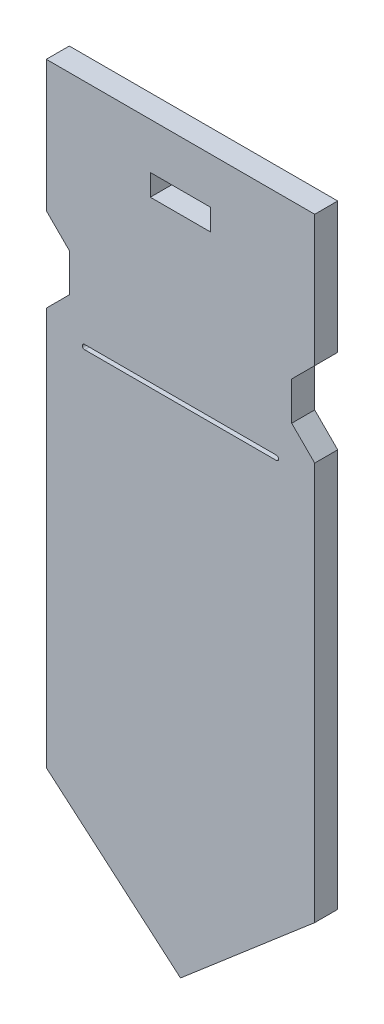
ISO-10303-21;
HEADER;
FILE_DESCRIPTION(('STEP AP214'),'2;1');
FILE_NAME('part.step','',(''),(''),'','','');
FILE_SCHEMA(('AUTOMOTIVE_DESIGN { 1 0 10303 214 1 1 1 1 }'));
ENDSEC;
DATA;
#1=APPLICATION_CONTEXT('core data for automotive mechanical design processes');
#2=APPLICATION_PROTOCOL_DEFINITION('international standard','automotive_design',2000,#1);
#3=PRODUCT_CONTEXT('',#1,'mechanical');
#4=PRODUCT('Part','Part','',(#3));
#5=PRODUCT_RELATED_PRODUCT_CATEGORY('part','',(#4));
#6=PRODUCT_DEFINITION_FORMATION('','',#4);
#7=PRODUCT_DEFINITION_CONTEXT('part definition',#1,'design');
#8=PRODUCT_DEFINITION('design','',#6,#7);
#9=PRODUCT_DEFINITION_SHAPE('','',#8);
#10=(LENGTH_UNIT() NAMED_UNIT(*) SI_UNIT(.MILLI.,.METRE.));
#11=(NAMED_UNIT(*) PLANE_ANGLE_UNIT() SI_UNIT($,.RADIAN.));
#12=(NAMED_UNIT(*) SI_UNIT($,.STERADIAN.) SOLID_ANGLE_UNIT());
#13=UNCERTAINTY_MEASURE_WITH_UNIT(LENGTH_MEASURE(1.E-05),#10,'distance_accuracy_value','');
#14=(GEOMETRIC_REPRESENTATION_CONTEXT(3) GLOBAL_UNCERTAINTY_ASSIGNED_CONTEXT((#13)) GLOBAL_UNIT_ASSIGNED_CONTEXT((#10,
#11,#12)) REPRESENTATION_CONTEXT('',''));
#15=CARTESIAN_POINT('',(0.,0.,0.));
#16=DIRECTION('',(0.,0.,1.));
#17=DIRECTION('',(1.,0.,0.));
#18=AXIS2_PLACEMENT_3D('',#15,#16,#17);
#19=CARTESIAN_POINT('',(32.,0.,3.));
#20=DIRECTION('',(-1.,0.,0.));
#21=DIRECTION('',(0.,0.,1.));
#22=AXIS2_PLACEMENT_3D('',#19,#20,#21);
#23=PLANE('',#22);
#24=DIRECTION('',(0.,1.,0.));
#25=VECTOR('',#24,1.);
#26=CARTESIAN_POINT('',(32.,0.,0.));
#27=LINE('',#26,#25);
#28=CARTESIAN_POINT('',(32.,-25.1,0.));
#29=VERTEX_POINT('',#28);
#30=CARTESIAN_POINT('',(32.,-20.1,0.));
#31=VERTEX_POINT('',#30);
#32=EDGE_CURVE('E323',#29,#31,#27,.T.);
#33=ORIENTED_EDGE('',*,*,#32,.T.);
#34=DIRECTION('',(0.,0.,-1.));
#35=VECTOR('',#34,1.);
#36=CARTESIAN_POINT('',(32.,-20.1,3.));
#37=LINE('',#36,#35);
#38=CARTESIAN_POINT('',(32.,-20.1,3.));
#39=VERTEX_POINT('',#38);
#40=EDGE_CURVE('E11',#39,#31,#37,.T.);
#41=ORIENTED_EDGE('',*,*,#40,.F.);
#42=DIRECTION('',(0.,1.,0.));
#43=VECTOR('',#42,1.);
#44=CARTESIAN_POINT('',(32.,0.,3.));
#45=LINE('',#44,#43);
#46=CARTESIAN_POINT('',(32.,-25.1,3.));
#47=VERTEX_POINT('',#46);
#48=EDGE_CURVE('E225',#47,#39,#45,.T.);
#49=ORIENTED_EDGE('',*,*,#48,.F.);
#50=DIRECTION('',(0.,0.,-1.));
#51=VECTOR('',#50,1.);
#52=CARTESIAN_POINT('',(32.,-25.1,3.));
#53=LINE('',#52,#51);
#54=EDGE_CURVE('E256',#47,#29,#53,.T.);
#55=ORIENTED_EDGE('',*,*,#54,.T.);
#56=EDGE_LOOP('',(#33,#41,#49,#55));
#57=FACE_BOUND('',#56,.T.);
#58=ADVANCED_FACE('F41',(#57),#23,.F.);
#59=CARTESIAN_POINT('',(26.05,-26.05,3.));
#60=DIRECTION('',(-0.707106781186548,0.707106781186547,0.));
#61=DIRECTION('',(-0.707106781186547,-0.707106781186548,0.));
#62=AXIS2_PLACEMENT_3D('',#59,#60,#61);
#63=PLANE('',#62);
#64=DIRECTION('',(0.707106781186547,0.707106781186548,0.));
#65=VECTOR('',#64,1.);
#66=CARTESIAN_POINT('',(26.05,-26.05,0.));
#67=LINE('',#66,#65);
#68=CARTESIAN_POINT('',(35.,-17.1,0.));
#69=VERTEX_POINT('',#68);
#70=EDGE_CURVE('E326',#31,#69,#67,.T.);
#71=ORIENTED_EDGE('',*,*,#70,.T.);
#72=DIRECTION('',(0.,0.,-1.));
#73=VECTOR('',#72,1.);
#74=CARTESIAN_POINT('',(35.,-17.1,3.));
#75=LINE('',#74,#73);
#76=CARTESIAN_POINT('',(35.,-17.1,3.));
#77=VERTEX_POINT('',#76);
#78=EDGE_CURVE('E51',#77,#69,#75,.T.);
#79=ORIENTED_EDGE('',*,*,#78,.F.);
#80=DIRECTION('',(0.707106781186547,0.707106781186548,0.));
#81=VECTOR('',#80,1.);
#82=CARTESIAN_POINT('',(26.05,-26.05,3.));
#83=LINE('',#82,#81);
#84=EDGE_CURVE('E220',#39,#77,#83,.T.);
#85=ORIENTED_EDGE('',*,*,#84,.F.);
#86=ORIENTED_EDGE('',*,*,#40,.T.);
#87=EDGE_LOOP('',(#71,#79,#85,#86));
#88=FACE_BOUND('',#87,.T.);
#89=ADVANCED_FACE('F385',(#88),#63,.F.);
#90=CARTESIAN_POINT('',(35.,0.,3.));
#91=DIRECTION('',(1.,0.,0.));
#92=DIRECTION('',(0.,1.,0.));
#93=AXIS2_PLACEMENT_3D('',#90,#91,#92);
#94=PLANE('',#93);
#95=DIRECTION('',(0.,-1.,0.));
#96=VECTOR('',#95,1.);
#97=CARTESIAN_POINT('',(35.,0.,0.));
#98=LINE('',#97,#96);
#99=CARTESIAN_POINT('',(35.,0.,0.));
#100=VERTEX_POINT('',#99);
#101=EDGE_CURVE('E252',#100,#69,#98,.T.);
#102=ORIENTED_EDGE('',*,*,#101,.F.);
#103=DIRECTION('',(0.,0.,-1.));
#104=VECTOR('',#103,1.);
#105=CARTESIAN_POINT('',(35.,0.,3.));
#106=LINE('',#105,#104);
#107=CARTESIAN_POINT('',(35.,0.,3.));
#108=VERTEX_POINT('',#107);
#109=EDGE_CURVE('E273',#108,#100,#106,.T.);
#110=ORIENTED_EDGE('',*,*,#109,.F.);
#111=DIRECTION('',(0.,-1.,0.));
#112=VECTOR('',#111,1.);
#113=CARTESIAN_POINT('',(35.,0.,3.));
#114=LINE('',#113,#112);
#115=EDGE_CURVE('E213',#108,#77,#114,.T.);
#116=ORIENTED_EDGE('',*,*,#115,.T.);
#117=ORIENTED_EDGE('',*,*,#78,.T.);
#118=EDGE_LOOP('',(#102,#110,#116,#117));
#119=FACE_BOUND('',#118,.T.);
#120=ADVANCED_FACE('F383',(#119),#94,.T.);
#121=CARTESIAN_POINT('',(0.,0.,3.));
#122=DIRECTION('',(0.,1.,0.));
#123=DIRECTION('',(0.,0.,1.));
#124=AXIS2_PLACEMENT_3D('',#121,#122,#123);
#125=PLANE('',#124);
#126=DIRECTION('',(1.,0.,0.));
#127=VECTOR('',#126,1.);
#128=CARTESIAN_POINT('',(0.,0.,0.));
#129=LINE('',#128,#127);
#130=CARTESIAN_POINT('',(0.,0.,0.));
#131=VERTEX_POINT('',#130);
#132=EDGE_CURVE('E330',#131,#100,#129,.T.);
#133=ORIENTED_EDGE('',*,*,#132,.F.);
#134=DIRECTION('',(0.,0.,-1.));
#135=VECTOR('',#134,1.);
#136=CARTESIAN_POINT('',(0.,0.,3.));
#137=LINE('',#136,#135);
#138=CARTESIAN_POINT('',(0.,0.,3.));
#139=VERTEX_POINT('',#138);
#140=EDGE_CURVE('E271',#139,#131,#137,.T.);
#141=ORIENTED_EDGE('',*,*,#140,.F.);
#142=DIRECTION('',(1.,0.,0.));
#143=VECTOR('',#142,1.);
#144=CARTESIAN_POINT('',(0.,0.,3.));
#145=LINE('',#144,#143);
#146=EDGE_CURVE('E219',#139,#108,#145,.T.);
#147=ORIENTED_EDGE('',*,*,#146,.T.);
#148=ORIENTED_EDGE('',*,*,#109,.T.);
#149=EDGE_LOOP('',(#133,#141,#147,#148));
#150=FACE_BOUND('',#149,.T.);
#151=ADVANCED_FACE('F381',(#150),#125,.T.);
#152=CARTESIAN_POINT('',(0.,0.,3.));
#153=DIRECTION('',(1.,0.,0.));
#154=DIRECTION('',(0.,1.,0.));
#155=AXIS2_PLACEMENT_3D('',#152,#153,#154);
#156=PLANE('',#155);
#157=DIRECTION('',(0.,-1.,0.));
#158=VECTOR('',#157,1.);
#159=CARTESIAN_POINT('',(0.,0.,0.));
#160=LINE('',#159,#158);
#161=CARTESIAN_POINT('',(0.,-17.1,0.));
#162=VERTEX_POINT('',#161);
#163=EDGE_CURVE('E333',#131,#162,#160,.T.);
#164=ORIENTED_EDGE('',*,*,#163,.T.);
#165=DIRECTION('',(0.,0.,-1.));
#166=VECTOR('',#165,1.);
#167=CARTESIAN_POINT('',(0.,-17.1,3.));
#168=LINE('',#167,#166);
#169=CARTESIAN_POINT('',(0.,-17.1,3.));
#170=VERTEX_POINT('',#169);
#171=EDGE_CURVE('E269',#170,#162,#168,.T.);
#172=ORIENTED_EDGE('',*,*,#171,.F.);
#173=DIRECTION('',(0.,-1.,0.));
#174=VECTOR('',#173,1.);
#175=CARTESIAN_POINT('',(0.,0.,3.));
#176=LINE('',#175,#174);
#177=EDGE_CURVE('E224',#139,#170,#176,.T.);
#178=ORIENTED_EDGE('',*,*,#177,.F.);
#179=ORIENTED_EDGE('',*,*,#140,.T.);
#180=EDGE_LOOP('',(#164,#172,#178,#179));
#181=FACE_BOUND('',#180,.T.);
#182=ADVANCED_FACE('F378',(#181),#156,.F.);
#183=CARTESIAN_POINT('',(-8.55,-8.55000000000001,3.));
#184=DIRECTION('',(-0.707106781186547,-0.707106781186548,0.));
#185=DIRECTION('',(0.707106781186548,-0.707106781186547,0.));
#186=AXIS2_PLACEMENT_3D('',#183,#184,#185);
#187=PLANE('',#186);
#188=DIRECTION('',(-0.707106781186548,0.707106781186547,0.));
#189=VECTOR('',#188,1.);
#190=CARTESIAN_POINT('',(-8.55,-8.55000000000001,0.));
#191=LINE('',#190,#189);
#192=CARTESIAN_POINT('',(3.,-20.1,0.));
#193=VERTEX_POINT('',#192);
#194=EDGE_CURVE('E336',#193,#162,#191,.T.);
#195=ORIENTED_EDGE('',*,*,#194,.F.);
#196=DIRECTION('',(0.,0.,-1.));
#197=VECTOR('',#196,1.);
#198=CARTESIAN_POINT('',(3.,-20.1,3.));
#199=LINE('',#198,#197);
#200=CARTESIAN_POINT('',(3.,-20.1,3.));
#201=VERTEX_POINT('',#200);
#202=EDGE_CURVE('E267',#201,#193,#199,.T.);
#203=ORIENTED_EDGE('',*,*,#202,.F.);
#204=DIRECTION('',(-0.707106781186548,0.707106781186547,0.));
#205=VECTOR('',#204,1.);
#206=CARTESIAN_POINT('',(-8.55,-8.55000000000001,3.));
#207=LINE('',#206,#205);
#208=EDGE_CURVE('E375',#201,#170,#207,.T.);
#209=ORIENTED_EDGE('',*,*,#208,.T.);
#210=ORIENTED_EDGE('',*,*,#171,.T.);
#211=EDGE_LOOP('',(#195,#203,#209,#210));
#212=FACE_BOUND('',#211,.T.);
#213=ADVANCED_FACE('F371',(#212),#187,.T.);
#214=CARTESIAN_POINT('',(3.,0.,3.));
#215=DIRECTION('',(-1.,0.,0.));
#216=DIRECTION('',(0.,-1.,0.));
#217=AXIS2_PLACEMENT_3D('',#214,#215,#216);
#218=PLANE('',#217);
#219=DIRECTION('',(0.,1.,0.));
#220=VECTOR('',#219,1.);
#221=CARTESIAN_POINT('',(3.,0.,0.));
#222=LINE('',#221,#220);
#223=CARTESIAN_POINT('',(3.,-25.1,0.));
#224=VERTEX_POINT('',#223);
#225=EDGE_CURVE('E340',#224,#193,#222,.T.);
#226=ORIENTED_EDGE('',*,*,#225,.F.);
#227=DIRECTION('',(0.,0.,-1.));
#228=VECTOR('',#227,1.);
#229=CARTESIAN_POINT('',(3.,-25.1,3.));
#230=LINE('',#229,#228);
#231=CARTESIAN_POINT('',(3.,-25.1,3.));
#232=VERTEX_POINT('',#231);
#233=EDGE_CURVE('E265',#232,#224,#230,.T.);
#234=ORIENTED_EDGE('',*,*,#233,.F.);
#235=DIRECTION('',(0.,1.,0.));
#236=VECTOR('',#235,1.);
#237=CARTESIAN_POINT('',(3.,0.,3.));
#238=LINE('',#237,#236);
#239=EDGE_CURVE('E589',#232,#201,#238,.T.);
#240=ORIENTED_EDGE('',*,*,#239,.T.);
#241=ORIENTED_EDGE('',*,*,#202,.T.);
#242=EDGE_LOOP('',(#226,#234,#240,#241));
#243=FACE_BOUND('',#242,.T.);
#244=ADVANCED_FACE('F366',(#243),#218,.T.);
#245=CARTESIAN_POINT('',(14.05,-14.0499999999999,3.));
#246=DIRECTION('',(-0.707106781186549,0.707106781186546,0.));
#247=DIRECTION('',(-0.707106781186546,-0.707106781186549,0.));
#248=AXIS2_PLACEMENT_3D('',#245,#246,#247);
#249=PLANE('',#248);
#250=DIRECTION('',(0.707106781186546,0.707106781186549,0.));
#251=VECTOR('',#250,1.);
#252=CARTESIAN_POINT('',(14.05,-14.0499999999999,0.));
#253=LINE('',#252,#251);
#254=CARTESIAN_POINT('',(0.,-28.1,0.));
#255=VERTEX_POINT('',#254);
#256=EDGE_CURVE('E343',#255,#224,#253,.T.);
#257=ORIENTED_EDGE('',*,*,#256,.F.);
#258=DIRECTION('',(0.,0.,-1.));
#259=VECTOR('',#258,1.);
#260=CARTESIAN_POINT('',(0.,-28.1,3.));
#261=LINE('',#260,#259);
#262=CARTESIAN_POINT('',(0.,-28.1,3.));
#263=VERTEX_POINT('',#262);
#264=EDGE_CURVE('E263',#263,#255,#261,.T.);
#265=ORIENTED_EDGE('',*,*,#264,.F.);
#266=DIRECTION('',(0.707106781186546,0.707106781186549,0.));
#267=VECTOR('',#266,1.);
#268=CARTESIAN_POINT('',(14.05,-14.0499999999999,3.));
#269=LINE('',#268,#267);
#270=EDGE_CURVE('E362',#263,#232,#269,.T.);
#271=ORIENTED_EDGE('',*,*,#270,.T.);
#272=ORIENTED_EDGE('',*,*,#233,.T.);
#273=EDGE_LOOP('',(#257,#265,#271,#272));
#274=FACE_BOUND('',#273,.T.);
#275=ADVANCED_FACE('F358',(#274),#249,.T.);
#276=CARTESIAN_POINT('',(0.,-80.,0.));
#277=VERTEX_POINT('',#276);
#278=EDGE_CURVE('E337',#255,#277,#160,.T.);
#279=ORIENTED_EDGE('',*,*,#278,.T.);
#280=DIRECTION('',(0.,0.,-1.));
#281=VECTOR('',#280,1.);
#282=CARTESIAN_POINT('',(0.,-80.,3.));
#283=LINE('',#282,#281);
#284=CARTESIAN_POINT('',(0.,-80.,3.));
#285=VERTEX_POINT('',#284);
#286=EDGE_CURVE('E261',#285,#277,#283,.T.);
#287=ORIENTED_EDGE('',*,*,#286,.F.);
#288=EDGE_CURVE('E584',#263,#285,#176,.T.);
#289=ORIENTED_EDGE('',*,*,#288,.F.);
#290=ORIENTED_EDGE('',*,*,#264,.T.);
#291=EDGE_LOOP('',(#279,#287,#289,#290));
#292=FACE_BOUND('',#291,.T.);
#293=ADVANCED_FACE('F353',(#292),#156,.F.);
#294=CARTESIAN_POINT('',(-39.5294117647059,-46.1176470588236,3.));
#295=DIRECTION('',(-0.650791373455968,-0.759256602365297,0.));
#296=DIRECTION('',(0.759256602365297,-0.650791373455968,0.));
#297=AXIS2_PLACEMENT_3D('',#294,#295,#296);
#298=PLANE('',#297);
#299=DIRECTION('',(-0.759256602365297,0.650791373455968,0.));
#300=VECTOR('',#299,1.);
#301=CARTESIAN_POINT('',(-39.5294117647059,-46.1176470588236,0.));
#302=LINE('',#301,#300);
#303=CARTESIAN_POINT('',(17.5,-95.,0.));
#304=VERTEX_POINT('',#303);
#305=EDGE_CURVE('E345',#304,#277,#302,.T.);
#306=ORIENTED_EDGE('',*,*,#305,.F.);
#307=DIRECTION('',(0.,0.,-1.));
#308=VECTOR('',#307,1.);
#309=CARTESIAN_POINT('',(17.5,-95.,3.));
#310=LINE('',#309,#308);
#311=CARTESIAN_POINT('',(17.5,-95.,3.));
#312=VERTEX_POINT('',#311);
#313=EDGE_CURVE('E203',#312,#304,#310,.T.);
#314=ORIENTED_EDGE('',*,*,#313,.F.);
#315=DIRECTION('',(-0.759256602365297,0.650791373455968,0.));
#316=VECTOR('',#315,1.);
#317=CARTESIAN_POINT('',(-39.5294117647059,-46.1176470588236,3.));
#318=LINE('',#317,#316);
#319=EDGE_CURVE('E209',#312,#285,#318,.T.);
#320=ORIENTED_EDGE('',*,*,#319,.T.);
#321=ORIENTED_EDGE('',*,*,#286,.T.);
#322=EDGE_LOOP('',(#306,#314,#320,#321));
#323=FACE_BOUND('',#322,.T.);
#324=ADVANCED_FACE('F463',(#323),#298,.T.);
#325=CARTESIAN_POINT('',(54.3529411764706,-63.4117647058824,3.));
#326=DIRECTION('',(0.650791373455968,-0.759256602365297,0.));
#327=DIRECTION('',(0.759256602365297,0.650791373455968,0.));
#328=AXIS2_PLACEMENT_3D('',#325,#326,#327);
#329=PLANE('',#328);
#330=DIRECTION('',(-0.759256602365297,-0.650791373455968,0.));
#331=VECTOR('',#330,1.);
#332=CARTESIAN_POINT('',(54.3529411764706,-63.4117647058824,0.));
#333=LINE('',#332,#331);
#334=CARTESIAN_POINT('',(35.,-80.,0.));
#335=VERTEX_POINT('',#334);
#336=EDGE_CURVE('E198',#335,#304,#333,.T.);
#337=ORIENTED_EDGE('',*,*,#336,.F.);
#338=DIRECTION('',(0.,0.,-1.));
#339=VECTOR('',#338,1.);
#340=CARTESIAN_POINT('',(35.,-80.,3.));
#341=LINE('',#340,#339);
#342=CARTESIAN_POINT('',(35.,-80.,3.));
#343=VERTEX_POINT('',#342);
#344=EDGE_CURVE('E193',#343,#335,#341,.T.);
#345=ORIENTED_EDGE('',*,*,#344,.F.);
#346=DIRECTION('',(-0.759256602365297,-0.650791373455968,0.));
#347=VECTOR('',#346,1.);
#348=CARTESIAN_POINT('',(54.3529411764706,-63.4117647058824,3.));
#349=LINE('',#348,#347);
#350=EDGE_CURVE('E196',#343,#312,#349,.T.);
#351=ORIENTED_EDGE('',*,*,#350,.T.);
#352=ORIENTED_EDGE('',*,*,#313,.T.);
#353=EDGE_LOOP('',(#337,#345,#351,#352));
#354=FACE_BOUND('',#353,.T.);
#355=ADVANCED_FACE('F195',(#354),#329,.T.);
#356=CARTESIAN_POINT('',(35.,-28.1,0.));
#357=VERTEX_POINT('',#356);
#358=EDGE_CURVE('E249',#357,#335,#98,.T.);
#359=ORIENTED_EDGE('',*,*,#358,.F.);
#360=DIRECTION('',(0.,0.,-1.));
#361=VECTOR('',#360,1.);
#362=CARTESIAN_POINT('',(35.,-28.1,3.));
#363=LINE('',#362,#361);
#364=CARTESIAN_POINT('',(35.,-28.1,3.));
#365=VERTEX_POINT('',#364);
#366=EDGE_CURVE('E127',#365,#357,#363,.T.);
#367=ORIENTED_EDGE('',*,*,#366,.F.);
#368=EDGE_CURVE('E207',#365,#343,#114,.T.);
#369=ORIENTED_EDGE('',*,*,#368,.T.);
#370=ORIENTED_EDGE('',*,*,#344,.T.);
#371=EDGE_LOOP('',(#359,#367,#369,#370));
#372=FACE_BOUND('',#371,.T.);
#373=ADVANCED_FACE('F211',(#372),#94,.T.);
#374=CARTESIAN_POINT('',(0.,-6.,3.));
#375=DIRECTION('',(0.,1.,0.));
#376=DIRECTION('',(0.,0.,1.));
#377=AXIS2_PLACEMENT_3D('',#374,#375,#376);
#378=PLANE('',#377);
#379=DIRECTION('',(1.,0.,0.));
#380=VECTOR('',#379,1.);
#381=CARTESIAN_POINT('',(0.,-6.,0.));
#382=LINE('',#381,#380);
#383=CARTESIAN_POINT('',(13.563,-6.,0.));
#384=VERTEX_POINT('',#383);
#385=CARTESIAN_POINT('',(21.437,-6.,0.));
#386=VERTEX_POINT('',#385);
#387=EDGE_CURVE('E311',#384,#386,#382,.T.);
#388=ORIENTED_EDGE('',*,*,#387,.T.);
#389=DIRECTION('',(0.,0.,-1.));
#390=VECTOR('',#389,1.);
#391=CARTESIAN_POINT('',(21.437,-6.,3.));
#392=LINE('',#391,#390);
#393=CARTESIAN_POINT('',(21.437,-6.,3.));
#394=VERTEX_POINT('',#393);
#395=EDGE_CURVE('E258',#394,#386,#392,.T.);
#396=ORIENTED_EDGE('',*,*,#395,.F.);
#397=DIRECTION('',(1.,0.,0.));
#398=VECTOR('',#397,1.);
#399=CARTESIAN_POINT('',(0.,-6.,3.));
#400=LINE('',#399,#398);
#401=CARTESIAN_POINT('',(13.563,-6.,3.));
#402=VERTEX_POINT('',#401);
#403=EDGE_CURVE('E237',#402,#394,#400,.T.);
#404=ORIENTED_EDGE('',*,*,#403,.F.);
#405=DIRECTION('',(0.,0.,-1.));
#406=VECTOR('',#405,1.);
#407=CARTESIAN_POINT('',(13.563,-6.,3.));
#408=LINE('',#407,#406);
#409=EDGE_CURVE('E276',#402,#384,#408,.T.);
#410=ORIENTED_EDGE('',*,*,#409,.T.);
#411=EDGE_LOOP('',(#388,#396,#404,#410));
#412=FACE_BOUND('',#411,.T.);
#413=ADVANCED_FACE('F423',(#412),#378,.F.);
#414=CARTESIAN_POINT('',(21.437,0.,3.));
#415=DIRECTION('',(1.,0.,0.));
#416=DIRECTION('',(0.,0.,-1.));
#417=AXIS2_PLACEMENT_3D('',#414,#415,#416);
#418=PLANE('',#417);
#419=DIRECTION('',(0.,-1.,0.));
#420=VECTOR('',#419,1.);
#421=CARTESIAN_POINT('',(21.437,0.,0.));
#422=LINE('',#421,#420);
#423=CARTESIAN_POINT('',(21.437,-8.794,0.));
#424=VERTEX_POINT('',#423);
#425=EDGE_CURVE('E314',#386,#424,#422,.T.);
#426=ORIENTED_EDGE('',*,*,#425,.T.);
#427=DIRECTION('',(0.,0.,-1.));
#428=VECTOR('',#427,1.);
#429=CARTESIAN_POINT('',(21.437,-8.794,3.));
#430=LINE('',#429,#428);
#431=CARTESIAN_POINT('',(21.437,-8.794,3.));
#432=VERTEX_POINT('',#431);
#433=EDGE_CURVE('E280',#432,#424,#430,.T.);
#434=ORIENTED_EDGE('',*,*,#433,.F.);
#435=DIRECTION('',(0.,-1.,0.));
#436=VECTOR('',#435,1.);
#437=CARTESIAN_POINT('',(21.437,0.,3.));
#438=LINE('',#437,#436);
#439=EDGE_CURVE('E235',#394,#432,#438,.T.);
#440=ORIENTED_EDGE('',*,*,#439,.F.);
#441=ORIENTED_EDGE('',*,*,#395,.T.);
#442=EDGE_LOOP('',(#426,#434,#440,#441));
#443=FACE_BOUND('',#442,.T.);
#444=ADVANCED_FACE('F419',(#443),#418,.F.);
#445=CARTESIAN_POINT('',(0.,-8.794,3.));
#446=DIRECTION('',(0.,1.,0.));
#447=DIRECTION('',(0.,0.,1.));
#448=AXIS2_PLACEMENT_3D('',#445,#446,#447);
#449=PLANE('',#448);
#450=DIRECTION('',(1.,0.,0.));
#451=VECTOR('',#450,1.);
#452=CARTESIAN_POINT('',(0.,-8.794,0.));
#453=LINE('',#452,#451);
#454=CARTESIAN_POINT('',(13.563,-8.794,0.));
#455=VERTEX_POINT('',#454);
#456=EDGE_CURVE('E317',#455,#424,#453,.T.);
#457=ORIENTED_EDGE('',*,*,#456,.F.);
#458=DIRECTION('',(0.,0.,-1.));
#459=VECTOR('',#458,1.);
#460=CARTESIAN_POINT('',(13.563,-8.794,3.));
#461=LINE('',#460,#459);
#462=CARTESIAN_POINT('',(13.563,-8.794,3.));
#463=VERTEX_POINT('',#462);
#464=EDGE_CURVE('E278',#463,#455,#461,.T.);
#465=ORIENTED_EDGE('',*,*,#464,.F.);
#466=DIRECTION('',(1.,0.,0.));
#467=VECTOR('',#466,1.);
#468=CARTESIAN_POINT('',(0.,-8.794,3.));
#469=LINE('',#468,#467);
#470=EDGE_CURVE('E232',#463,#432,#469,.T.);
#471=ORIENTED_EDGE('',*,*,#470,.T.);
#472=ORIENTED_EDGE('',*,*,#433,.T.);
#473=EDGE_LOOP('',(#457,#465,#471,#472));
#474=FACE_BOUND('',#473,.T.);
#475=ADVANCED_FACE('F416',(#474),#449,.T.);
#476=CARTESIAN_POINT('',(30.,-30.,3.));
#477=DIRECTION('',(0.,0.,-1.));
#478=DIRECTION('',(-1.,0.,0.));
#479=AXIS2_PLACEMENT_3D('',#476,#477,#478);
#480=CYLINDRICAL_SURFACE('',#479,0.300000000000002);
#481=CARTESIAN_POINT('',(30.,-30.,0.));
#482=DIRECTION('',(0.,0.,1.));
#483=DIRECTION('',(1.,0.,0.));
#484=AXIS2_PLACEMENT_3D('',#481,#482,#483);
#485=CIRCLE('',#484,0.300000000000002);
#486=CARTESIAN_POINT('',(30.,-30.3,0.));
#487=VERTEX_POINT('',#486);
#488=CARTESIAN_POINT('',(30.,-29.7,0.));
#489=VERTEX_POINT('',#488);
#490=EDGE_CURVE('E297',#487,#489,#485,.T.);
#491=ORIENTED_EDGE('',*,*,#490,.F.);
#492=DIRECTION('',(0.,0.,-1.));
#493=VECTOR('',#492,1.);
#494=CARTESIAN_POINT('',(30.,-30.3,3.));
#495=LINE('',#494,#493);
#496=CARTESIAN_POINT('',(30.,-30.3,3.));
#497=VERTEX_POINT('',#496);
#498=EDGE_CURVE('E45',#497,#487,#495,.T.);
#499=ORIENTED_EDGE('',*,*,#498,.F.);
#500=CARTESIAN_POINT('',(30.,-30.,3.));
#501=DIRECTION('',(0.,0.,1.));
#502=DIRECTION('',(1.,0.,0.));
#503=AXIS2_PLACEMENT_3D('',#500,#501,#502);
#504=CIRCLE('',#503,0.300000000000002);
#505=CARTESIAN_POINT('',(30.,-29.7,3.));
#506=VERTEX_POINT('',#505);
#507=EDGE_CURVE('E248',#497,#506,#504,.T.);
#508=ORIENTED_EDGE('',*,*,#507,.T.);
#509=DIRECTION('',(0.,0.,-1.));
#510=VECTOR('',#509,1.);
#511=CARTESIAN_POINT('',(30.,-29.7,3.));
#512=LINE('',#511,#510);
#513=EDGE_CURVE('E214',#506,#489,#512,.T.);
#514=ORIENTED_EDGE('',*,*,#513,.T.);
#515=EDGE_LOOP('',(#491,#499,#508,#514));
#516=FACE_BOUND('',#515,.T.);
#517=ADVANCED_FACE('F43',(#516),#480,.F.);
#518=CARTESIAN_POINT('',(0.,-30.3,3.));
#519=DIRECTION('',(0.,1.,0.));
#520=DIRECTION('',(0.,0.,1.));
#521=AXIS2_PLACEMENT_3D('',#518,#519,#520);
#522=PLANE('',#521);
#523=DIRECTION('',(1.,0.,0.));
#524=VECTOR('',#523,1.);
#525=CARTESIAN_POINT('',(0.,-30.3,0.));
#526=LINE('',#525,#524);
#527=CARTESIAN_POINT('',(5.,-30.3,0.));
#528=VERTEX_POINT('',#527);
#529=EDGE_CURVE('E293',#528,#487,#526,.T.);
#530=ORIENTED_EDGE('',*,*,#529,.F.);
#531=DIRECTION('',(0.,0.,-1.));
#532=VECTOR('',#531,1.);
#533=CARTESIAN_POINT('',(5.,-30.3,3.));
#534=LINE('',#533,#532);
#535=CARTESIAN_POINT('',(5.,-30.3,3.));
#536=VERTEX_POINT('',#535);
#537=EDGE_CURVE('E286',#536,#528,#534,.T.);
#538=ORIENTED_EDGE('',*,*,#537,.F.);
#539=DIRECTION('',(1.,0.,0.));
#540=VECTOR('',#539,1.);
#541=CARTESIAN_POINT('',(0.,-30.3,3.));
#542=LINE('',#541,#540);
#543=EDGE_CURVE('E245',#536,#497,#542,.T.);
#544=ORIENTED_EDGE('',*,*,#543,.T.);
#545=ORIENTED_EDGE('',*,*,#498,.T.);
#546=EDGE_LOOP('',(#530,#538,#544,#545));
#547=FACE_BOUND('',#546,.T.);
#548=ADVANCED_FACE('F291',(#547),#522,.T.);
#549=CARTESIAN_POINT('',(5.,-30.,3.));
#550=DIRECTION('',(0.,0.,-1.));
#551=DIRECTION('',(-1.,0.,0.));
#552=AXIS2_PLACEMENT_3D('',#549,#550,#551);
#553=CYLINDRICAL_SURFACE('',#552,0.300000000000002);
#554=CARTESIAN_POINT('',(5.,-30.,0.));
#555=DIRECTION('',(0.,0.,1.));
#556=DIRECTION('',(1.,0.,0.));
#557=AXIS2_PLACEMENT_3D('',#554,#555,#556);
#558=CIRCLE('',#557,0.300000000000002);
#559=CARTESIAN_POINT('',(5.,-29.7,0.));
#560=VERTEX_POINT('',#559);
#561=EDGE_CURVE('E305',#560,#528,#558,.T.);
#562=ORIENTED_EDGE('',*,*,#561,.F.);
#563=DIRECTION('',(0.,0.,-1.));
#564=VECTOR('',#563,1.);
#565=CARTESIAN_POINT('',(5.,-29.7,3.));
#566=LINE('',#565,#564);
#567=CARTESIAN_POINT('',(5.,-29.7,3.));
#568=VERTEX_POINT('',#567);
#569=EDGE_CURVE('E285',#568,#560,#566,.T.);
#570=ORIENTED_EDGE('',*,*,#569,.F.);
#571=CARTESIAN_POINT('',(5.,-30.,3.));
#572=DIRECTION('',(0.,0.,1.));
#573=DIRECTION('',(1.,0.,0.));
#574=AXIS2_PLACEMENT_3D('',#571,#572,#573);
#575=CIRCLE('',#574,0.300000000000002);
#576=EDGE_CURVE('E242',#568,#536,#575,.T.);
#577=ORIENTED_EDGE('',*,*,#576,.T.);
#578=ORIENTED_EDGE('',*,*,#537,.T.);
#579=EDGE_LOOP('',(#562,#570,#577,#578));
#580=FACE_BOUND('',#579,.T.);
#581=ADVANCED_FACE('F414',(#580),#553,.F.);
#582=CARTESIAN_POINT('',(13.563,0.,3.));
#583=DIRECTION('',(1.,0.,0.));
#584=DIRECTION('',(0.,1.,0.));
#585=AXIS2_PLACEMENT_3D('',#582,#583,#584);
#586=PLANE('',#585);
#587=DIRECTION('',(0.,-1.,0.));
#588=VECTOR('',#587,1.);
#589=CARTESIAN_POINT('',(13.563,0.,0.));
#590=LINE('',#589,#588);
#591=EDGE_CURVE('E320',#384,#455,#590,.T.);
#592=ORIENTED_EDGE('',*,*,#591,.F.);
#593=ORIENTED_EDGE('',*,*,#409,.F.);
#594=DIRECTION('',(0.,-1.,0.));
#595=VECTOR('',#594,1.);
#596=CARTESIAN_POINT('',(13.563,0.,3.));
#597=LINE('',#596,#595);
#598=EDGE_CURVE('E227',#402,#463,#597,.T.);
#599=ORIENTED_EDGE('',*,*,#598,.T.);
#600=ORIENTED_EDGE('',*,*,#464,.T.);
#601=EDGE_LOOP('',(#592,#593,#599,#600));
#602=FACE_BOUND('',#601,.T.);
#603=ADVANCED_FACE('F399',(#602),#586,.T.);
#604=CARTESIAN_POINT('',(0.,-29.7,3.));
#605=DIRECTION('',(0.,1.,0.));
#606=DIRECTION('',(0.,0.,1.));
#607=AXIS2_PLACEMENT_3D('',#604,#605,#606);
#608=PLANE('',#607);
#609=DIRECTION('',(1.,0.,0.));
#610=VECTOR('',#609,1.);
#611=CARTESIAN_POINT('',(0.,-29.7,0.));
#612=LINE('',#611,#610);
#613=EDGE_CURVE('E307',#560,#489,#612,.T.);
#614=ORIENTED_EDGE('',*,*,#613,.T.);
#615=ORIENTED_EDGE('',*,*,#513,.F.);
#616=DIRECTION('',(1.,0.,0.));
#617=VECTOR('',#616,1.);
#618=CARTESIAN_POINT('',(0.,-29.7,3.));
#619=LINE('',#618,#617);
#620=EDGE_CURVE('E240',#568,#506,#619,.T.);
#621=ORIENTED_EDGE('',*,*,#620,.F.);
#622=ORIENTED_EDGE('',*,*,#569,.T.);
#623=EDGE_LOOP('',(#614,#615,#621,#622));
#624=FACE_BOUND('',#623,.T.);
#625=ADVANCED_FACE('F391',(#624),#608,.F.);
#626=CARTESIAN_POINT('',(3.45000000000011,3.45000000000009,3.));
#627=DIRECTION('',(-0.707106781186549,-0.707106781186545,0.));
#628=DIRECTION('',(0.707106781186546,-0.70710678118655,0.));
#629=AXIS2_PLACEMENT_3D('',#626,#627,#628);
#630=PLANE('',#629);
#631=DIRECTION('',(-0.707106781186546,0.70710678118655,0.));
#632=VECTOR('',#631,1.);
#633=CARTESIAN_POINT('',(3.45000000000011,3.45000000000009,0.));
#634=LINE('',#633,#632);
#635=EDGE_CURVE('E130',#357,#29,#634,.T.);
#636=ORIENTED_EDGE('',*,*,#635,.T.);
#637=ORIENTED_EDGE('',*,*,#54,.F.);
#638=DIRECTION('',(-0.707106781186546,0.70710678118655,0.));
#639=VECTOR('',#638,1.);
#640=CARTESIAN_POINT('',(3.45000000000011,3.45000000000009,3.));
#641=LINE('',#640,#639);
#642=EDGE_CURVE('E60',#365,#47,#641,.T.);
#643=ORIENTED_EDGE('',*,*,#642,.F.);
#644=ORIENTED_EDGE('',*,*,#366,.T.);
#645=EDGE_LOOP('',(#636,#637,#643,#644));
#646=FACE_BOUND('',#645,.T.);
#647=ADVANCED_FACE('F389',(#646),#630,.F.);
#648=CARTESIAN_POINT('',(0.,0.,3.));
#649=DIRECTION('',(0.,0.,1.));
#650=DIRECTION('',(1.,0.,0.));
#651=AXIS2_PLACEMENT_3D('',#648,#649,#650);
#652=PLANE('',#651);
#653=ORIENTED_EDGE('',*,*,#507,.F.);
#654=ORIENTED_EDGE('',*,*,#543,.F.);
#655=ORIENTED_EDGE('',*,*,#576,.F.);
#656=ORIENTED_EDGE('',*,*,#620,.T.);
#657=EDGE_LOOP('',(#653,#654,#655,#656));
#658=FACE_BOUND('',#657,.T.);
#659=ORIENTED_EDGE('',*,*,#403,.T.);
#660=ORIENTED_EDGE('',*,*,#439,.T.);
#661=ORIENTED_EDGE('',*,*,#470,.F.);
#662=ORIENTED_EDGE('',*,*,#598,.F.);
#663=EDGE_LOOP('',(#659,#660,#661,#662));
#664=FACE_BOUND('',#663,.T.);
#665=ORIENTED_EDGE('',*,*,#48,.T.);
#666=ORIENTED_EDGE('',*,*,#84,.T.);
#667=ORIENTED_EDGE('',*,*,#115,.F.);
#668=ORIENTED_EDGE('',*,*,#146,.F.);
#669=ORIENTED_EDGE('',*,*,#177,.T.);
#670=ORIENTED_EDGE('',*,*,#208,.F.);
#671=ORIENTED_EDGE('',*,*,#239,.F.);
#672=ORIENTED_EDGE('',*,*,#270,.F.);
#673=ORIENTED_EDGE('',*,*,#288,.T.);
#674=ORIENTED_EDGE('',*,*,#319,.F.);
#675=ORIENTED_EDGE('',*,*,#350,.F.);
#676=ORIENTED_EDGE('',*,*,#368,.F.);
#677=ORIENTED_EDGE('',*,*,#642,.T.);
#678=EDGE_LOOP('',(#665,#666,#667,#668,#669,#670,#671,#672,#673,#674,#675,#676,#677));
#679=FACE_BOUND('',#678,.T.);
#680=ADVANCED_FACE('F206',(#658,#664,#679),#652,.T.);
#681=CARTESIAN_POINT('',(0.,0.,0.));
#682=DIRECTION('',(0.,0.,1.));
#683=DIRECTION('',(1.,0.,0.));
#684=AXIS2_PLACEMENT_3D('',#681,#682,#683);
#685=PLANE('',#684);
#686=ORIENTED_EDGE('',*,*,#490,.T.);
#687=ORIENTED_EDGE('',*,*,#613,.F.);
#688=ORIENTED_EDGE('',*,*,#561,.T.);
#689=ORIENTED_EDGE('',*,*,#529,.T.);
#690=EDGE_LOOP('',(#686,#687,#688,#689));
#691=FACE_BOUND('',#690,.T.);
#692=ORIENTED_EDGE('',*,*,#387,.F.);
#693=ORIENTED_EDGE('',*,*,#591,.T.);
#694=ORIENTED_EDGE('',*,*,#456,.T.);
#695=ORIENTED_EDGE('',*,*,#425,.F.);
#696=EDGE_LOOP('',(#692,#693,#694,#695));
#697=FACE_BOUND('',#696,.T.);
#698=ORIENTED_EDGE('',*,*,#32,.F.);
#699=ORIENTED_EDGE('',*,*,#635,.F.);
#700=ORIENTED_EDGE('',*,*,#358,.T.);
#701=ORIENTED_EDGE('',*,*,#336,.T.);
#702=ORIENTED_EDGE('',*,*,#305,.T.);
#703=ORIENTED_EDGE('',*,*,#278,.F.);
#704=ORIENTED_EDGE('',*,*,#256,.T.);
#705=ORIENTED_EDGE('',*,*,#225,.T.);
#706=ORIENTED_EDGE('',*,*,#194,.T.);
#707=ORIENTED_EDGE('',*,*,#163,.F.);
#708=ORIENTED_EDGE('',*,*,#132,.T.);
#709=ORIENTED_EDGE('',*,*,#101,.T.);
#710=ORIENTED_EDGE('',*,*,#70,.F.);
#711=EDGE_LOOP('',(#698,#699,#700,#701,#702,#703,#704,#705,#706,#707,#708,#709,#710));
#712=FACE_BOUND('',#711,.T.);
#713=ADVANCED_FACE('F303',(#691,#697,#712),#685,.F.);
#714=CLOSED_SHELL('',(#58,#89,#120,#151,#182,#213,#244,#275,#293,#324,#355,#373,#413,#444,#475,
#517,#548,#581,#603,#625,#647,#680,#713));
#715=MANIFOLD_SOLID_BREP('B2',#714);
#716=ADVANCED_BREP_SHAPE_REPRESENTATION('',(#18,#715),#14);
#717=SHAPE_DEFINITION_REPRESENTATION(#9,#716);
ENDSEC;
END-ISO-10303-21;
